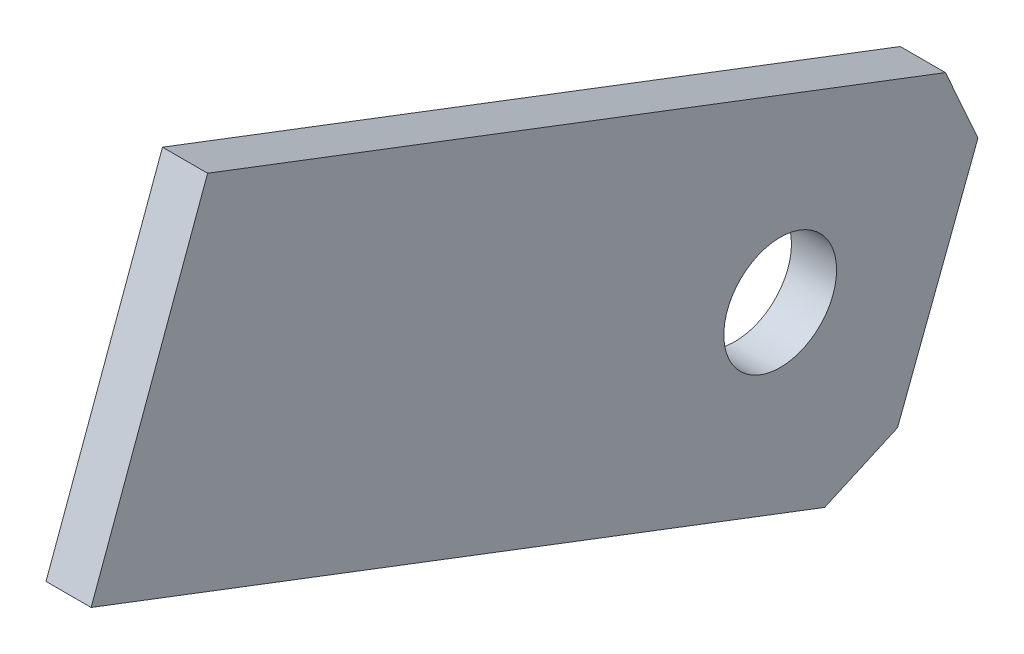
ISO-10303-21;
HEADER;
FILE_DESCRIPTION(('STEP AP214'),'2;1');
FILE_NAME('part.step','',(''),(''),'','','');
FILE_SCHEMA(('AUTOMOTIVE_DESIGN { 1 0 10303 214 1 1 1 1 }'));
ENDSEC;
DATA;
#1=APPLICATION_CONTEXT('core data for automotive mechanical design processes');
#2=APPLICATION_PROTOCOL_DEFINITION('international standard','automotive_design',2000,#1);
#3=PRODUCT_CONTEXT('',#1,'mechanical');
#4=PRODUCT('Part','Part','',(#3));
#5=PRODUCT_RELATED_PRODUCT_CATEGORY('part','',(#4));
#6=PRODUCT_DEFINITION_FORMATION('','',#4);
#7=PRODUCT_DEFINITION_CONTEXT('part definition',#1,'design');
#8=PRODUCT_DEFINITION('design','',#6,#7);
#9=PRODUCT_DEFINITION_SHAPE('','',#8);
#10=(LENGTH_UNIT() NAMED_UNIT(*) SI_UNIT(.MILLI.,.METRE.));
#11=(NAMED_UNIT(*) PLANE_ANGLE_UNIT() SI_UNIT($,.RADIAN.));
#12=(NAMED_UNIT(*) SI_UNIT($,.STERADIAN.) SOLID_ANGLE_UNIT());
#13=UNCERTAINTY_MEASURE_WITH_UNIT(LENGTH_MEASURE(1.E-05),#10,'distance_accuracy_value','');
#14=(GEOMETRIC_REPRESENTATION_CONTEXT(3) GLOBAL_UNCERTAINTY_ASSIGNED_CONTEXT((#13)) GLOBAL_UNIT_ASSIGNED_CONTEXT((#10,
#11,#12)) REPRESENTATION_CONTEXT('',''));
#15=CARTESIAN_POINT('',(0.,0.,0.));
#16=DIRECTION('',(0.,0.,1.));
#17=DIRECTION('',(1.,0.,0.));
#18=AXIS2_PLACEMENT_3D('',#15,#16,#17);
#19=CARTESIAN_POINT('',(4.9000000834467,387.327723707334,1659.23254221438));
#20=DIRECTION('',(0.,0.934212738399166,-0.356716357086034));
#21=DIRECTION('',(0.,0.356716357086034,0.934212738399166));
#22=AXIS2_PLACEMENT_3D('',#19,#20,#21);
#23=PLANE('',#22);
#24=DIRECTION('',(0.,-0.356716357086034,-0.934212738399166));
#25=VECTOR('',#24,1.);
#26=CARTESIAN_POINT('',(4.9000000834467,387.327723707334,1659.23254221438));
#27=LINE('',#26,#25);
#28=CARTESIAN_POINT('',(4.9000000834467,387.327723707334,1659.23254221438));
#29=VERTEX_POINT('',#28);
#30=CARTESIAN_POINT('',(4.9000000834467,362.35757871131,1593.83765052643));
#31=VERTEX_POINT('',#30);
#32=EDGE_CURVE('E114',#29,#31,#27,.T.);
#33=ORIENTED_EDGE('',*,*,#32,.T.);
#34=DIRECTION('',(-1.,0.,0.));
#35=VECTOR('',#34,1.);
#36=CARTESIAN_POINT('',(4.9000000834467,362.35757871131,1593.83765052643));
#37=LINE('',#36,#35);
#38=CARTESIAN_POINT('',(0.9000000834467,362.35757871131,1593.83765052643));
#39=VERTEX_POINT('',#38);
#40=EDGE_CURVE('E134',#31,#39,#37,.T.);
#41=ORIENTED_EDGE('',*,*,#40,.T.);
#42=DIRECTION('',(0.,-0.356716357086034,-0.934212738399166));
#43=VECTOR('',#42,1.);
#44=CARTESIAN_POINT('',(0.9000000834467,387.327723707334,1659.23254221438));
#45=LINE('',#44,#43);
#46=CARTESIAN_POINT('',(0.9000000834467,387.327723707334,1659.23254221438));
#47=VERTEX_POINT('',#46);
#48=EDGE_CURVE('E119',#47,#39,#45,.T.);
#49=ORIENTED_EDGE('',*,*,#48,.F.);
#50=DIRECTION('',(-1.,0.,0.));
#51=VECTOR('',#50,1.);
#52=CARTESIAN_POINT('',(4.9000000834467,387.327723707334,1659.23254221438));
#53=LINE('',#52,#51);
#54=EDGE_CURVE('E109',#29,#47,#53,.T.);
#55=ORIENTED_EDGE('',*,*,#54,.F.);
#56=EDGE_LOOP('',(#33,#41,#49,#55));
#57=FACE_BOUND('',#56,.T.);
#58=ADVANCED_FACE('F41',(#57),#23,.T.);
#59=CARTESIAN_POINT('',(4.9000000834467,359.15720175503,1669.55654186186));
#60=DIRECTION('',(0.,0.344102109918957,0.93893223288442));
#61=DIRECTION('',(0.,-0.93893223288442,0.344102109918957));
#62=AXIS2_PLACEMENT_3D('',#59,#60,#61);
#63=PLANE('',#62);
#64=DIRECTION('',(0.,0.93893223288442,-0.344102109918957));
#65=VECTOR('',#64,1.);
#66=CARTESIAN_POINT('',(0.9000000834467,359.15720175503,1669.55654186186));
#67=LINE('',#66,#65);
#68=CARTESIAN_POINT('',(0.9000000834467,359.15720175503,1669.55654186186));
#69=VERTEX_POINT('',#68);
#70=EDGE_CURVE('E107',#69,#47,#67,.T.);
#71=ORIENTED_EDGE('',*,*,#70,.F.);
#72=DIRECTION('',(-1.,0.,0.));
#73=VECTOR('',#72,1.);
#74=CARTESIAN_POINT('',(4.9000000834467,359.15720175503,1669.55654186186));
#75=LINE('',#74,#73);
#76=CARTESIAN_POINT('',(4.9000000834467,359.15720175503,1669.55654186186));
#77=VERTEX_POINT('',#76);
#78=EDGE_CURVE('E96',#77,#69,#75,.T.);
#79=ORIENTED_EDGE('',*,*,#78,.F.);
#80=DIRECTION('',(0.,0.93893223288442,-0.344102109918957));
#81=VECTOR('',#80,1.);
#82=CARTESIAN_POINT('',(4.9000000834467,359.15720175503,1669.55654186186));
#83=LINE('',#82,#81);
#84=EDGE_CURVE('E100',#77,#29,#83,.T.);
#85=ORIENTED_EDGE('',*,*,#84,.T.);
#86=ORIENTED_EDGE('',*,*,#54,.T.);
#87=EDGE_LOOP('',(#71,#79,#85,#86));
#88=FACE_BOUND('',#87,.T.);
#89=ADVANCED_FACE('F105',(#88),#63,.T.);
#90=CARTESIAN_POINT('',(4.9000000834467,332.547614773904,1599.86807754702));
#91=DIRECTION('',(0.,-0.934212738399166,0.356716357086036));
#92=DIRECTION('',(0.,-0.356716357086036,-0.934212738399166));
#93=AXIS2_PLACEMENT_3D('',#90,#91,#92);
#94=PLANE('',#93);
#95=DIRECTION('',(0.,0.356716357086036,0.934212738399166));
#96=VECTOR('',#95,1.);
#97=CARTESIAN_POINT('',(0.9000000834467,332.547614773904,1599.86807754702));
#98=LINE('',#97,#96);
#99=CARTESIAN_POINT('',(0.9000000834467,334.331196559334,1604.53914123902));
#100=VERTEX_POINT('',#99);
#101=EDGE_CURVE('E128',#100,#69,#98,.T.);
#102=ORIENTED_EDGE('',*,*,#101,.F.);
#103=DIRECTION('',(1.,0.,0.));
#104=VECTOR('',#103,1.);
#105=CARTESIAN_POINT('',(4.9000000834467,334.331196559334,1604.53914123902));
#106=LINE('',#105,#104);
#107=CARTESIAN_POINT('',(4.9000000834467,334.331196559334,1604.53914123902));
#108=VERTEX_POINT('',#107);
#109=EDGE_CURVE('E11',#100,#108,#106,.T.);
#110=ORIENTED_EDGE('',*,*,#109,.T.);
#111=DIRECTION('',(0.,0.356716357086036,0.934212738399166));
#112=VECTOR('',#111,1.);
#113=CARTESIAN_POINT('',(4.9000000834467,332.547614773904,1599.86807754702));
#114=LINE('',#113,#112);
#115=EDGE_CURVE('E93',#108,#77,#114,.T.);
#116=ORIENTED_EDGE('',*,*,#115,.T.);
#117=ORIENTED_EDGE('',*,*,#78,.T.);
#118=EDGE_LOOP('',(#102,#110,#116,#117));
#119=FACE_BOUND('',#118,.T.);
#120=ADVANCED_FACE('F95',(#119),#94,.T.);
#121=CARTESIAN_POINT('',(4.9000000834467,360.573996925881,1589.16658683444));
#122=DIRECTION('',(0.,-0.356716357086037,-0.934212738399165));
#123=DIRECTION('',(0.,0.934212738399165,-0.356716357086037));
#124=AXIS2_PLACEMENT_3D('',#121,#122,#123);
#125=PLANE('',#124);
#126=DIRECTION('',(0.,-0.934212738399165,0.356716357086037));
#127=VECTOR('',#126,1.);
#128=CARTESIAN_POINT('',(0.9000000834467,360.573996925881,1589.16658683444));
#129=LINE('',#128,#127);
#130=CARTESIAN_POINT('',(0.9000000834467,355.902933233888,1590.95016861987));
#131=VERTEX_POINT('',#130);
#132=CARTESIAN_POINT('',(0.9000000834467,337.218678465896,1598.0844957616));
#133=VERTEX_POINT('',#132);
#134=EDGE_CURVE('E123',#131,#133,#129,.T.);
#135=ORIENTED_EDGE('',*,*,#134,.F.);
#136=DIRECTION('',(1.,0.,0.));
#137=VECTOR('',#136,1.);
#138=CARTESIAN_POINT('',(4.9000000834467,355.902933233888,1590.95016861987));
#139=LINE('',#138,#137);
#140=CARTESIAN_POINT('',(4.9000000834467,355.902933233888,1590.95016861987));
#141=VERTEX_POINT('',#140);
#142=EDGE_CURVE('E149',#131,#141,#139,.T.);
#143=ORIENTED_EDGE('',*,*,#142,.T.);
#144=DIRECTION('',(0.,-0.934212738399165,0.356716357086037));
#145=VECTOR('',#144,1.);
#146=CARTESIAN_POINT('',(4.9000000834467,360.573996925881,1589.16658683444));
#147=LINE('',#146,#145);
#148=CARTESIAN_POINT('',(4.9000000834467,337.218678465896,1598.0844957616));
#149=VERTEX_POINT('',#148);
#150=EDGE_CURVE('E101',#141,#149,#147,.T.);
#151=ORIENTED_EDGE('',*,*,#150,.T.);
#152=DIRECTION('',(-1.,0.,0.));
#153=VECTOR('',#152,1.);
#154=CARTESIAN_POINT('',(4.9000000834467,337.218678465896,1598.0844957616));
#155=LINE('',#154,#153);
#156=EDGE_CURVE('E145',#149,#133,#155,.T.);
#157=ORIENTED_EDGE('',*,*,#156,.T.);
#158=EDGE_LOOP('',(#135,#143,#151,#157));
#159=FACE_BOUND('',#158,.T.);
#160=ADVANCED_FACE('F167',(#159),#125,.T.);
#161=CARTESIAN_POINT('',(4.9000000834467,0.,0.));
#162=DIRECTION('',(-1.,0.,0.));
#163=DIRECTION('',(0.,0.,1.));
#164=AXIS2_PLACEMENT_3D('',#161,#162,#163);
#165=PLANE('',#164);
#166=CARTESIAN_POINT('',(4.9000000834467,352.03572843023,1608.48310789207));
#167=DIRECTION('',(1.,0.,0.));
#168=DIRECTION('',(0.,0.,-1.));
#169=AXIS2_PLACEMENT_3D('',#166,#167,#168);
#170=CIRCLE('',#169,4.99952687210359);
#171=CARTESIAN_POINT('',(4.9000000834467,352.03572843023,1603.48358101997));
#172=VERTEX_POINT('',#171);
#173=EDGE_CURVE('E201',#172,#172,#170,.T.);
#174=ORIENTED_EDGE('',*,*,#173,.F.);
#175=EDGE_LOOP('',(#174));
#176=FACE_BOUND('',#175,.T.);
#177=ORIENTED_EDGE('',*,*,#150,.F.);
#178=DIRECTION('',(0.,-0.912824717448705,-0.408351607336977));
#179=VECTOR('',#178,1.);
#180=CARTESIAN_POINT('',(4.9000000834467,362.35757871131,1593.83765052643));
#181=LINE('',#180,#179);
#182=EDGE_CURVE('E50',#141,#31,#181,.F.);
#183=ORIENTED_EDGE('',*,*,#182,.T.);
#184=ORIENTED_EDGE('',*,*,#32,.F.);
#185=ORIENTED_EDGE('',*,*,#84,.F.);
#186=ORIENTED_EDGE('',*,*,#115,.F.);
#187=DIRECTION('',(0.,-0.40835160733699,0.912824717448699));
#188=VECTOR('',#187,1.);
#189=CARTESIAN_POINT('',(4.9000000834467,337.218678465896,1598.0844957616));
#190=LINE('',#189,#188);
#191=EDGE_CURVE('E62',#108,#149,#190,.F.);
#192=ORIENTED_EDGE('',*,*,#191,.T.);
#193=EDGE_LOOP('',(#177,#183,#184,#185,#186,#192));
#194=FACE_BOUND('',#193,.T.);
#195=ADVANCED_FACE('F112',(#176,#194),#165,.F.);
#196=CARTESIAN_POINT('',(0.9000000834467,0.,0.));
#197=DIRECTION('',(-1.,0.,0.));
#198=DIRECTION('',(0.,0.,1.));
#199=AXIS2_PLACEMENT_3D('',#196,#197,#198);
#200=PLANE('',#199);
#201=CARTESIAN_POINT('',(0.900000083446695,352.03572843023,1608.48310789207));
#202=DIRECTION('',(1.,0.,0.));
#203=DIRECTION('',(0.,0.,-1.));
#204=AXIS2_PLACEMENT_3D('',#201,#202,#203);
#205=CIRCLE('',#204,4.99952687210359);
#206=CARTESIAN_POINT('',(0.900000083446695,352.03572843023,1603.48358101997));
#207=VERTEX_POINT('',#206);
#208=EDGE_CURVE('E124',#207,#207,#205,.T.);
#209=ORIENTED_EDGE('',*,*,#208,.T.);
#210=EDGE_LOOP('',(#209));
#211=FACE_BOUND('',#210,.T.);
#212=ORIENTED_EDGE('',*,*,#48,.T.);
#213=DIRECTION('',(0.,0.912824717448705,0.408351607336977));
#214=VECTOR('',#213,1.);
#215=CARTESIAN_POINT('',(0.9000000834467,-533.684966602988,1192.99353814955));
#216=LINE('',#215,#214);
#217=EDGE_CURVE('E142',#39,#131,#216,.F.);
#218=ORIENTED_EDGE('',*,*,#217,.T.);
#219=ORIENTED_EDGE('',*,*,#134,.T.);
#220=DIRECTION('',(0.,0.40835160733699,-0.912824717448699));
#221=VECTOR('',#220,1.);
#222=CARTESIAN_POINT('',(0.9000000834467,876.678608882025,392.181666657214));
#223=LINE('',#222,#221);
#224=EDGE_CURVE('E139',#133,#100,#223,.F.);
#225=ORIENTED_EDGE('',*,*,#224,.T.);
#226=ORIENTED_EDGE('',*,*,#101,.T.);
#227=ORIENTED_EDGE('',*,*,#70,.T.);
#228=EDGE_LOOP('',(#212,#218,#219,#225,#226,#227));
#229=FACE_BOUND('',#228,.T.);
#230=ADVANCED_FACE('F165',(#211,#229),#200,.T.);
#231=CARTESIAN_POINT('',(4.9000000834467,352.03572843023,1608.48310789207));
#232=DIRECTION('',(1.,0.,0.));
#233=DIRECTION('',(0.,0.,-1.));
#234=AXIS2_PLACEMENT_3D('',#231,#232,#233);
#235=CYLINDRICAL_SURFACE('',#234,4.99952687210359);
#236=ORIENTED_EDGE('',*,*,#208,.F.);
#237=EDGE_LOOP('',(#236));
#238=FACE_BOUND('',#237,.T.);
#239=ORIENTED_EDGE('',*,*,#173,.T.);
#240=EDGE_LOOP('',(#239));
#241=FACE_BOUND('',#240,.T.);
#242=ADVANCED_FACE('F174',(#238,#241),#235,.F.);
#243=CARTESIAN_POINT('',(4.9000000834467,362.35757871131,1593.83765052643));
#244=DIRECTION('',(0.,-0.408351607336977,0.912824717448704));
#245=DIRECTION('',(-1.,0.,0.));
#246=AXIS2_PLACEMENT_3D('',#243,#244,#245);
#247=PLANE('',#246);
#248=ORIENTED_EDGE('',*,*,#182,.F.);
#249=ORIENTED_EDGE('',*,*,#142,.F.);
#250=ORIENTED_EDGE('',*,*,#217,.F.);
#251=ORIENTED_EDGE('',*,*,#40,.F.);
#252=EDGE_LOOP('',(#248,#249,#250,#251));
#253=FACE_BOUND('',#252,.T.);
#254=ADVANCED_FACE('F162',(#253),#247,.F.);
#255=CARTESIAN_POINT('',(4.9000000834467,337.218678465896,1598.0844957616));
#256=DIRECTION('',(0.,0.912824717448699,0.40835160733699));
#257=DIRECTION('',(-1.,0.,0.));
#258=AXIS2_PLACEMENT_3D('',#255,#256,#257);
#259=PLANE('',#258);
#260=ORIENTED_EDGE('',*,*,#191,.F.);
#261=ORIENTED_EDGE('',*,*,#109,.F.);
#262=ORIENTED_EDGE('',*,*,#224,.F.);
#263=ORIENTED_EDGE('',*,*,#156,.F.);
#264=EDGE_LOOP('',(#260,#261,#262,#263));
#265=FACE_BOUND('',#264,.T.);
#266=ADVANCED_FACE('F43',(#265),#259,.F.);
#267=CLOSED_SHELL('',(#58,#89,#120,#160,#195,#230,#242,#254,#266));
#268=MANIFOLD_SOLID_BREP('B2',#267);
#269=ADVANCED_BREP_SHAPE_REPRESENTATION('',(#18,#268),#14);
#270=SHAPE_DEFINITION_REPRESENTATION(#9,#269);
ENDSEC;
END-ISO-10303-21;
